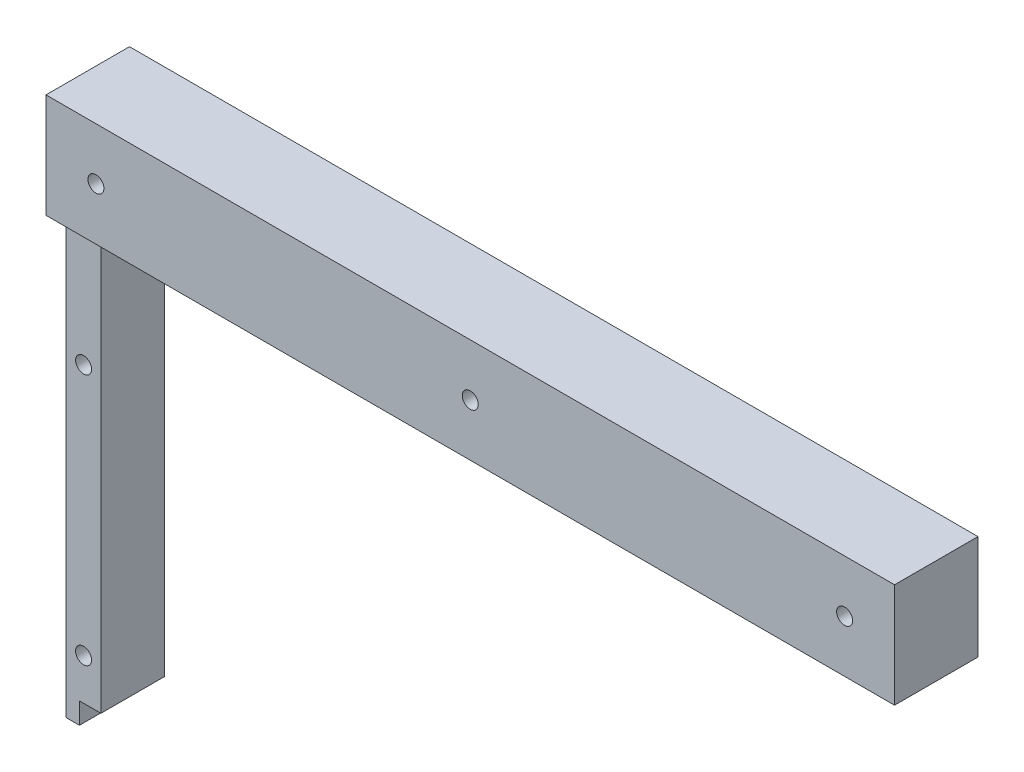
ISO-10303-21;
HEADER;
FILE_DESCRIPTION(('STEP AP214'),'2;1');
FILE_NAME('part.step','',(''),(''),'','','');
FILE_SCHEMA(('AUTOMOTIVE_DESIGN { 1 0 10303 214 1 1 1 1 }'));
ENDSEC;
DATA;
#1=APPLICATION_CONTEXT('core data for automotive mechanical design processes');
#2=APPLICATION_PROTOCOL_DEFINITION('international standard','automotive_design',2000,#1);
#3=PRODUCT_CONTEXT('',#1,'mechanical');
#4=PRODUCT('Part','Part','',(#3));
#5=PRODUCT_RELATED_PRODUCT_CATEGORY('part','',(#4));
#6=PRODUCT_DEFINITION_FORMATION('','',#4);
#7=PRODUCT_DEFINITION_CONTEXT('part definition',#1,'design');
#8=PRODUCT_DEFINITION('design','',#6,#7);
#9=PRODUCT_DEFINITION_SHAPE('','',#8);
#10=(LENGTH_UNIT() NAMED_UNIT(*) SI_UNIT(.MILLI.,.METRE.));
#11=(NAMED_UNIT(*) PLANE_ANGLE_UNIT() SI_UNIT($,.RADIAN.));
#12=(NAMED_UNIT(*) SI_UNIT($,.STERADIAN.) SOLID_ANGLE_UNIT());
#13=UNCERTAINTY_MEASURE_WITH_UNIT(LENGTH_MEASURE(1.E-05),#10,'distance_accuracy_value','');
#14=(GEOMETRIC_REPRESENTATION_CONTEXT(3) GLOBAL_UNCERTAINTY_ASSIGNED_CONTEXT((#13)) GLOBAL_UNIT_ASSIGNED_CONTEXT((#10,
#11,#12)) REPRESENTATION_CONTEXT('',''));
#15=CARTESIAN_POINT('',(0.,0.,0.));
#16=DIRECTION('',(0.,0.,1.));
#17=DIRECTION('',(1.,0.,0.));
#18=AXIS2_PLACEMENT_3D('',#15,#16,#17);
#19=CARTESIAN_POINT('',(-42.3157395725298,7.80592584925444,10.));
#20=DIRECTION('',(0.,1.,0.));
#21=DIRECTION('',(0.,0.,1.));
#22=AXIS2_PLACEMENT_3D('',#19,#20,#21);
#23=PLANE('',#22);
#24=DIRECTION('',(0.,0.,1.));
#25=VECTOR('',#24,1.);
#26=CARTESIAN_POINT('',(-110.544808884963,7.80592584925444,12.));
#27=LINE('',#26,#25);
#28=CARTESIAN_POINT('',(-110.544808884963,7.80592584925444,0.));
#29=VERTEX_POINT('',#28);
#30=CARTESIAN_POINT('',(-110.544808884963,7.80592584925444,9.0999999998743));
#31=VERTEX_POINT('',#30);
#32=EDGE_CURVE('E200',#29,#31,#27,.T.);
#33=ORIENTED_EDGE('',*,*,#32,.F.);
#34=DIRECTION('',(1.,0.,0.));
#35=VECTOR('',#34,1.);
#36=CARTESIAN_POINT('',(-42.3157395725298,7.80592584925444,0.));
#37=LINE('',#36,#35);
#38=CARTESIAN_POINT('',(6.45061647060174,7.80592584925444,0.));
#39=VERTEX_POINT('',#38);
#40=EDGE_CURVE('E53',#29,#39,#37,.T.);
#41=ORIENTED_EDGE('',*,*,#40,.T.);
#42=DIRECTION('',(0.,0.,-1.));
#43=VECTOR('',#42,1.);
#44=CARTESIAN_POINT('',(6.45061647060174,7.80592584925444,10.));
#45=LINE('',#44,#43);
#46=CARTESIAN_POINT('',(6.45061647060174,7.80592584925444,12.));
#47=VERTEX_POINT('',#46);
#48=EDGE_CURVE('E11',#47,#39,#45,.T.);
#49=ORIENTED_EDGE('',*,*,#48,.F.);
#50=DIRECTION('',(1.,0.,0.));
#51=VECTOR('',#50,1.);
#52=CARTESIAN_POINT('',(6.45061647060174,7.80592584925444,12.));
#53=LINE('',#52,#51);
#54=CARTESIAN_POINT('',(-115.549383529398,7.8059258492509,12.));
#55=VERTEX_POINT('',#54);
#56=EDGE_CURVE('E150',#55,#47,#53,.T.);
#57=ORIENTED_EDGE('',*,*,#56,.F.);
#58=DIRECTION('',(0.,0.,-1.));
#59=VECTOR('',#58,1.);
#60=CARTESIAN_POINT('',(-115.549383529398,7.8059258492509,9.0999999998743));
#61=LINE('',#60,#59);
#62=CARTESIAN_POINT('',(-115.549383529398,7.8059258492509,9.0999999998743));
#63=VERTEX_POINT('',#62);
#64=EDGE_CURVE('E110',#55,#63,#61,.T.);
#65=ORIENTED_EDGE('',*,*,#64,.T.);
#66=DIRECTION('',(-1.,0.,0.));
#67=VECTOR('',#66,1.);
#68=CARTESIAN_POINT('',(-46.4791394511663,7.80592584925083,9.09999999987429));
#69=LINE('',#68,#67);
#70=EDGE_CURVE('E47',#31,#63,#69,.T.);
#71=ORIENTED_EDGE('',*,*,#70,.F.);
#72=EDGE_LOOP('',(#33,#41,#49,#57,#65,#71));
#73=FACE_BOUND('',#72,.T.);
#74=ADVANCED_FACE('F32',(#73),#23,.F.);
#75=CARTESIAN_POINT('',(0.,-56.1940741507476,0.));
#76=DIRECTION('',(0.,1.,0.));
#77=DIRECTION('',(0.,0.,1.));
#78=AXIS2_PLACEMENT_3D('',#75,#76,#77);
#79=PLANE('',#78);
#80=DIRECTION('',(0.,0.,-1.));
#81=VECTOR('',#80,1.);
#82=CARTESIAN_POINT('',(-113.644808884963,-56.1940741507476,0.));
#83=LINE('',#82,#81);
#84=CARTESIAN_POINT('',(-113.644808884963,-56.1940741507476,9.0999999998743));
#85=VERTEX_POINT('',#84);
#86=CARTESIAN_POINT('',(-113.644808884963,-56.1940741507476,0.));
#87=VERTEX_POINT('',#86);
#88=EDGE_CURVE('E118',#85,#87,#83,.T.);
#89=ORIENTED_EDGE('',*,*,#88,.F.);
#90=DIRECTION('',(-1.,0.,0.));
#91=VECTOR('',#90,1.);
#92=CARTESIAN_POINT('',(-46.4791394511664,-56.1940741507477,9.09999999987429));
#93=LINE('',#92,#91);
#94=CARTESIAN_POINT('',(-115.549383529398,-56.1940741507476,9.0999999998743));
#95=VERTEX_POINT('',#94);
#96=EDGE_CURVE('E105',#85,#95,#93,.T.);
#97=ORIENTED_EDGE('',*,*,#96,.T.);
#98=DIRECTION('',(0.,0.,-1.));
#99=VECTOR('',#98,1.);
#100=CARTESIAN_POINT('',(-115.549383529398,-56.1940741507476,0.));
#101=LINE('',#100,#99);
#102=CARTESIAN_POINT('',(-115.549383529398,-56.1940741507476,0.));
#103=VERTEX_POINT('',#102);
#104=EDGE_CURVE('E116',#95,#103,#101,.T.);
#105=ORIENTED_EDGE('',*,*,#104,.T.);
#106=DIRECTION('',(1.,0.,0.));
#107=VECTOR('',#106,1.);
#108=CARTESIAN_POINT('',(-115.549383529398,-56.1940741507476,0.));
#109=LINE('',#108,#107);
#110=EDGE_CURVE('E124',#103,#87,#109,.T.);
#111=ORIENTED_EDGE('',*,*,#110,.T.);
#112=EDGE_LOOP('',(#89,#97,#105,#111));
#113=FACE_BOUND('',#112,.T.);
#114=ADVANCED_FACE('F114',(#113),#79,.F.);
#115=CARTESIAN_POINT('',(6.45061647060174,17.2415064484994,10.));
#116=DIRECTION('',(-1.,0.,0.));
#117=DIRECTION('',(0.,0.,1.));
#118=AXIS2_PLACEMENT_3D('',#115,#116,#117);
#119=PLANE('',#118);
#120=DIRECTION('',(0.,1.,0.));
#121=VECTOR('',#120,1.);
#122=CARTESIAN_POINT('',(6.45061647060174,17.2415064484994,0.));
#123=LINE('',#122,#121);
#124=CARTESIAN_POINT('',(6.45061647060174,22.8059258492525,0.));
#125=VERTEX_POINT('',#124);
#126=EDGE_CURVE('E40',#39,#125,#123,.T.);
#127=ORIENTED_EDGE('',*,*,#126,.T.);
#128=DIRECTION('',(0.,0.,-1.));
#129=VECTOR('',#128,1.);
#130=CARTESIAN_POINT('',(6.45061647060174,22.8059258492525,12.));
#131=LINE('',#130,#129);
#132=CARTESIAN_POINT('',(6.45061647060174,22.8059258492525,12.));
#133=VERTEX_POINT('',#132);
#134=EDGE_CURVE('E138',#133,#125,#131,.T.);
#135=ORIENTED_EDGE('',*,*,#134,.F.);
#136=DIRECTION('',(0.,1.,0.));
#137=VECTOR('',#136,1.);
#138=CARTESIAN_POINT('',(6.45061647060174,17.2415064484994,12.));
#139=LINE('',#138,#137);
#140=EDGE_CURVE('E148',#47,#133,#139,.T.);
#141=ORIENTED_EDGE('',*,*,#140,.F.);
#142=ORIENTED_EDGE('',*,*,#48,.T.);
#143=EDGE_LOOP('',(#127,#135,#141,#142));
#144=FACE_BOUND('',#143,.T.);
#145=ADVANCED_FACE('F156',(#144),#119,.F.);
#146=CARTESIAN_POINT('',(0.,0.,0.));
#147=DIRECTION('',(0.,0.,1.));
#148=DIRECTION('',(1.,0.,0.));
#149=AXIS2_PLACEMENT_3D('',#146,#147,#148);
#150=PLANE('',#149);
#151=CARTESIAN_POINT('',(-113.047096207181,-47.1993941862081,0.));
#152=DIRECTION('',(0.,0.,1.));
#153=DIRECTION('',(1.,0.,0.));
#154=AXIS2_PLACEMENT_3D('',#151,#152,#153);
#155=CIRCLE('',#154,1.15);
#156=CARTESIAN_POINT('',(-111.897096207181,-47.1993941862081,0.));
#157=VERTEX_POINT('',#156);
#158=EDGE_CURVE('E191',#157,#157,#155,.T.);
#159=ORIENTED_EDGE('',*,*,#158,.T.);
#160=EDGE_LOOP('',(#159));
#161=FACE_BOUND('',#160,.T.);
#162=CARTESIAN_POINT('',(-113.047096207181,-10.9967753140126,0.));
#163=DIRECTION('',(0.,0.,1.));
#164=DIRECTION('',(1.,0.,0.));
#165=AXIS2_PLACEMENT_3D('',#162,#163,#164);
#166=CIRCLE('',#165,1.15);
#167=CARTESIAN_POINT('',(-111.897096207181,-10.9967753140126,0.));
#168=VERTEX_POINT('',#167);
#169=EDGE_CURVE('E186',#168,#168,#166,.T.);
#170=ORIENTED_EDGE('',*,*,#169,.T.);
#171=EDGE_LOOP('',(#170));
#172=FACE_BOUND('',#171,.T.);
#173=ORIENTED_EDGE('',*,*,#40,.F.);
#174=DIRECTION('',(0.,1.,0.));
#175=VECTOR('',#174,1.);
#176=CARTESIAN_POINT('',(-110.544808884963,-53.145081868621,0.));
#177=LINE('',#176,#175);
#178=CARTESIAN_POINT('',(-110.544808884963,-53.145081868621,0.));
#179=VERTEX_POINT('',#178);
#180=EDGE_CURVE('E198',#179,#29,#177,.T.);
#181=ORIENTED_EDGE('',*,*,#180,.F.);
#182=DIRECTION('',(1.,0.,0.));
#183=VECTOR('',#182,1.);
#184=CARTESIAN_POINT('',(-113.644808884963,-53.145081868621,0.));
#185=LINE('',#184,#183);
#186=CARTESIAN_POINT('',(-113.644808884963,-53.145081868621,0.));
#187=VERTEX_POINT('',#186);
#188=EDGE_CURVE('E125',#187,#179,#185,.T.);
#189=ORIENTED_EDGE('',*,*,#188,.F.);
#190=DIRECTION('',(0.,1.,0.));
#191=VECTOR('',#190,1.);
#192=CARTESIAN_POINT('',(-113.644808884963,-56.1940741507476,0.));
#193=LINE('',#192,#191);
#194=EDGE_CURVE('E168',#87,#187,#193,.T.);
#195=ORIENTED_EDGE('',*,*,#194,.F.);
#196=ORIENTED_EDGE('',*,*,#110,.F.);
#197=DIRECTION('',(0.,1.,0.));
#198=VECTOR('',#197,1.);
#199=CARTESIAN_POINT('',(-115.549383529398,17.2415064484994,0.));
#200=LINE('',#199,#198);
#201=CARTESIAN_POINT('',(-115.549383529398,22.8059258492525,0.));
#202=VERTEX_POINT('',#201);
#203=EDGE_CURVE('E122',#103,#202,#200,.T.);
#204=ORIENTED_EDGE('',*,*,#203,.T.);
#205=DIRECTION('',(-1.,0.,0.));
#206=VECTOR('',#205,1.);
#207=CARTESIAN_POINT('',(-115.549383529398,22.8059258492525,0.));
#208=LINE('',#207,#206);
#209=EDGE_CURVE('E141',#125,#202,#208,.T.);
#210=ORIENTED_EDGE('',*,*,#209,.F.);
#211=ORIENTED_EDGE('',*,*,#126,.F.);
#212=EDGE_LOOP('',(#173,#181,#189,#195,#196,#204,#210,#211));
#213=FACE_BOUND('',#212,.T.);
#214=CARTESIAN_POINT('',(-0.724809871131812,15.3059258492535,0.));
#215=DIRECTION('',(0.,0.,1.));
#216=DIRECTION('',(-1.,0.,0.));
#217=AXIS2_PLACEMENT_3D('',#214,#215,#216);
#218=CIRCLE('',#217,1.15);
#219=CARTESIAN_POINT('',(-1.87480987113182,15.3059258492535,0.));
#220=VERTEX_POINT('',#219);
#221=EDGE_CURVE('E210',#220,#220,#218,.T.);
#222=ORIENTED_EDGE('',*,*,#221,.T.);
#223=EDGE_LOOP('',(#222));
#224=FACE_BOUND('',#223,.T.);
#225=CARTESIAN_POINT('',(-108.373957187665,15.3059258492535,0.));
#226=DIRECTION('',(0.,0.,1.));
#227=DIRECTION('',(1.,0.,0.));
#228=AXIS2_PLACEMENT_3D('',#225,#226,#227);
#229=CIRCLE('',#228,1.15);
#230=CARTESIAN_POINT('',(-107.223957187665,15.3059258492535,0.));
#231=VERTEX_POINT('',#230);
#232=EDGE_CURVE('E204',#231,#231,#229,.T.);
#233=ORIENTED_EDGE('',*,*,#232,.T.);
#234=EDGE_LOOP('',(#233));
#235=FACE_BOUND('',#234,.T.);
#236=CARTESIAN_POINT('',(-54.5493835293982,15.3059258492535,0.));
#237=DIRECTION('',(0.,0.,1.));
#238=DIRECTION('',(1.,0.,0.));
#239=AXIS2_PLACEMENT_3D('',#236,#237,#238);
#240=CIRCLE('',#239,1.15);
#241=CARTESIAN_POINT('',(-53.3993835293982,15.3059258492535,0.));
#242=VERTEX_POINT('',#241);
#243=EDGE_CURVE('E173',#242,#242,#240,.T.);
#244=ORIENTED_EDGE('',*,*,#243,.T.);
#245=EDGE_LOOP('',(#244));
#246=FACE_BOUND('',#245,.T.);
#247=ADVANCED_FACE('F163',(#161,#172,#213,#224,#235,#246),#150,.F.);
#248=CARTESIAN_POINT('',(0.,0.,12.));
#249=DIRECTION('',(0.,0.,-1.));
#250=DIRECTION('',(-1.,0.,0.));
#251=AXIS2_PLACEMENT_3D('',#248,#249,#250);
#252=PLANE('',#251);
#253=DIRECTION('',(0.,-1.,0.));
#254=VECTOR('',#253,1.);
#255=CARTESIAN_POINT('',(-115.549383529398,17.2415064484994,12.));
#256=LINE('',#255,#254);
#257=CARTESIAN_POINT('',(-115.549383529398,22.8059258492525,12.));
#258=VERTEX_POINT('',#257);
#259=EDGE_CURVE('E145',#258,#55,#256,.T.);
#260=ORIENTED_EDGE('',*,*,#259,.T.);
#261=ORIENTED_EDGE('',*,*,#56,.T.);
#262=ORIENTED_EDGE('',*,*,#140,.T.);
#263=DIRECTION('',(1.,0.,0.));
#264=VECTOR('',#263,1.);
#265=CARTESIAN_POINT('',(-115.549383529398,22.8059258492525,12.));
#266=LINE('',#265,#264);
#267=EDGE_CURVE('E135',#258,#133,#266,.T.);
#268=ORIENTED_EDGE('',*,*,#267,.F.);
#269=EDGE_LOOP('',(#260,#261,#262,#268));
#270=FACE_BOUND('',#269,.T.);
#271=CARTESIAN_POINT('',(-0.724809871131812,15.3059258492535,12.));
#272=DIRECTION('',(0.,0.,1.));
#273=DIRECTION('',(-1.,0.,0.));
#274=AXIS2_PLACEMENT_3D('',#271,#272,#273);
#275=CIRCLE('',#274,1.15);
#276=CARTESIAN_POINT('',(-1.87480987113182,15.3059258492535,12.));
#277=VERTEX_POINT('',#276);
#278=EDGE_CURVE('E203',#277,#277,#275,.T.);
#279=ORIENTED_EDGE('',*,*,#278,.F.);
#280=EDGE_LOOP('',(#279));
#281=FACE_BOUND('',#280,.T.);
#282=CARTESIAN_POINT('',(-108.373957187665,15.3059258492535,12.));
#283=DIRECTION('',(0.,0.,1.));
#284=DIRECTION('',(1.,0.,0.));
#285=AXIS2_PLACEMENT_3D('',#282,#283,#284);
#286=CIRCLE('',#285,1.15);
#287=CARTESIAN_POINT('',(-107.223957187665,15.3059258492535,12.));
#288=VERTEX_POINT('',#287);
#289=EDGE_CURVE('E207',#288,#288,#286,.T.);
#290=ORIENTED_EDGE('',*,*,#289,.F.);
#291=EDGE_LOOP('',(#290));
#292=FACE_BOUND('',#291,.T.);
#293=CARTESIAN_POINT('',(-54.5493835293982,15.3059258492535,12.));
#294=DIRECTION('',(0.,0.,1.));
#295=DIRECTION('',(1.,0.,0.));
#296=AXIS2_PLACEMENT_3D('',#293,#294,#295);
#297=CIRCLE('',#296,1.15);
#298=CARTESIAN_POINT('',(-53.3993835293982,15.3059258492535,12.));
#299=VERTEX_POINT('',#298);
#300=EDGE_CURVE('E177',#299,#299,#297,.T.);
#301=ORIENTED_EDGE('',*,*,#300,.F.);
#302=EDGE_LOOP('',(#301));
#303=FACE_BOUND('',#302,.T.);
#304=ADVANCED_FACE('F218',(#270,#281,#292,#303),#252,.F.);
#305=CARTESIAN_POINT('',(-115.549383529398,-56.1940741507483,239.999999999997));
#306=DIRECTION('',(1.,0.,0.));
#307=DIRECTION('',(0.,0.,-1.));
#308=AXIS2_PLACEMENT_3D('',#305,#306,#307);
#309=PLANE('',#308);
#310=ORIENTED_EDGE('',*,*,#104,.F.);
#311=DIRECTION('',(0.,-1.,0.));
#312=VECTOR('',#311,1.);
#313=CARTESIAN_POINT('',(-115.549383529398,7.8059258492509,9.0999999998743));
#314=LINE('',#313,#312);
#315=EDGE_CURVE('E102',#63,#95,#314,.T.);
#316=ORIENTED_EDGE('',*,*,#315,.F.);
#317=ORIENTED_EDGE('',*,*,#64,.F.);
#318=ORIENTED_EDGE('',*,*,#259,.F.);
#319=DIRECTION('',(0.,0.,1.));
#320=VECTOR('',#319,1.);
#321=CARTESIAN_POINT('',(-115.549383529398,22.8059258492525,12.));
#322=LINE('',#321,#320);
#323=EDGE_CURVE('E127',#202,#258,#322,.T.);
#324=ORIENTED_EDGE('',*,*,#323,.F.);
#325=ORIENTED_EDGE('',*,*,#203,.F.);
#326=EDGE_LOOP('',(#310,#316,#317,#318,#324,#325));
#327=FACE_BOUND('',#326,.T.);
#328=ADVANCED_FACE('F120',(#327),#309,.F.);
#329=CARTESIAN_POINT('',(0.,22.8059258492525,0.));
#330=DIRECTION('',(0.,-1.,0.));
#331=DIRECTION('',(0.,0.,-1.));
#332=AXIS2_PLACEMENT_3D('',#329,#330,#331);
#333=PLANE('',#332);
#334=ORIENTED_EDGE('',*,*,#323,.T.);
#335=ORIENTED_EDGE('',*,*,#267,.T.);
#336=ORIENTED_EDGE('',*,*,#134,.T.);
#337=ORIENTED_EDGE('',*,*,#209,.T.);
#338=EDGE_LOOP('',(#334,#335,#336,#337));
#339=FACE_BOUND('',#338,.T.);
#340=ADVANCED_FACE('F161',(#339),#333,.F.);
#341=CARTESIAN_POINT('',(-113.644808884963,-53.145081868621,0.));
#342=DIRECTION('',(0.,1.,0.));
#343=DIRECTION('',(0.,0.,1.));
#344=AXIS2_PLACEMENT_3D('',#341,#342,#343);
#345=PLANE('',#344);
#346=DIRECTION('',(0.,0.,-1.));
#347=VECTOR('',#346,1.);
#348=CARTESIAN_POINT('',(-110.544808884963,-53.145081868621,12.));
#349=LINE('',#348,#347);
#350=CARTESIAN_POINT('',(-110.544808884963,-53.145081868621,9.0999999998743));
#351=VERTEX_POINT('',#350);
#352=EDGE_CURVE('E194',#351,#179,#349,.T.);
#353=ORIENTED_EDGE('',*,*,#352,.F.);
#354=DIRECTION('',(-1.,0.,0.));
#355=VECTOR('',#354,1.);
#356=CARTESIAN_POINT('',(-113.644808884963,-53.145081868621,9.0999999998743));
#357=LINE('',#356,#355);
#358=CARTESIAN_POINT('',(-113.644808884963,-53.145081868621,9.0999999998743));
#359=VERTEX_POINT('',#358);
#360=EDGE_CURVE('E183',#351,#359,#357,.T.);
#361=ORIENTED_EDGE('',*,*,#360,.T.);
#362=DIRECTION('',(0.,0.,1.));
#363=VECTOR('',#362,1.);
#364=CARTESIAN_POINT('',(-113.644808884963,-53.145081868621,0.));
#365=LINE('',#364,#363);
#366=EDGE_CURVE('E172',#187,#359,#365,.T.);
#367=ORIENTED_EDGE('',*,*,#366,.F.);
#368=ORIENTED_EDGE('',*,*,#188,.T.);
#369=EDGE_LOOP('',(#353,#361,#367,#368));
#370=FACE_BOUND('',#369,.T.);
#371=ADVANCED_FACE('F239',(#370),#345,.F.);
#372=CARTESIAN_POINT('',(-113.644808884963,0.,0.));
#373=DIRECTION('',(1.,0.,0.));
#374=DIRECTION('',(0.,0.,-1.));
#375=AXIS2_PLACEMENT_3D('',#372,#373,#374);
#376=PLANE('',#375);
#377=DIRECTION('',(0.,1.,0.));
#378=VECTOR('',#377,1.);
#379=CARTESIAN_POINT('',(-113.644808884963,0.,9.0999999998743));
#380=LINE('',#379,#378);
#381=EDGE_CURVE('E181',#85,#359,#380,.T.);
#382=ORIENTED_EDGE('',*,*,#381,.F.);
#383=ORIENTED_EDGE('',*,*,#88,.T.);
#384=ORIENTED_EDGE('',*,*,#194,.T.);
#385=ORIENTED_EDGE('',*,*,#366,.T.);
#386=EDGE_LOOP('',(#382,#383,#384,#385));
#387=FACE_BOUND('',#386,.T.);
#388=ADVANCED_FACE('F180',(#387),#376,.T.);
#389=CARTESIAN_POINT('',(-54.5493835293982,15.3059258492535,0.));
#390=DIRECTION('',(0.,0.,1.));
#391=DIRECTION('',(1.,0.,0.));
#392=AXIS2_PLACEMENT_3D('',#389,#390,#391);
#393=CYLINDRICAL_SURFACE('',#392,1.15);
#394=ORIENTED_EDGE('',*,*,#243,.F.);
#395=EDGE_LOOP('',(#394));
#396=FACE_BOUND('',#395,.T.);
#397=ORIENTED_EDGE('',*,*,#300,.T.);
#398=EDGE_LOOP('',(#397));
#399=FACE_BOUND('',#398,.T.);
#400=ADVANCED_FACE('F228',(#396,#399),#393,.F.);
#401=CARTESIAN_POINT('',(-108.373957187665,15.3059258492535,0.));
#402=DIRECTION('',(0.,0.,1.));
#403=DIRECTION('',(1.,0.,0.));
#404=AXIS2_PLACEMENT_3D('',#401,#402,#403);
#405=CYLINDRICAL_SURFACE('',#404,1.15);
#406=ORIENTED_EDGE('',*,*,#232,.F.);
#407=EDGE_LOOP('',(#406));
#408=FACE_BOUND('',#407,.T.);
#409=ORIENTED_EDGE('',*,*,#289,.T.);
#410=EDGE_LOOP('',(#409));
#411=FACE_BOUND('',#410,.T.);
#412=ADVANCED_FACE('F230',(#408,#411),#405,.F.);
#413=CARTESIAN_POINT('',(-0.724809871131812,15.3059258492535,0.));
#414=DIRECTION('',(0.,0.,1.));
#415=DIRECTION('',(1.,0.,0.));
#416=AXIS2_PLACEMENT_3D('',#413,#414,#415);
#417=CYLINDRICAL_SURFACE('',#416,1.15);
#418=ORIENTED_EDGE('',*,*,#221,.F.);
#419=EDGE_LOOP('',(#418));
#420=FACE_BOUND('',#419,.T.);
#421=ORIENTED_EDGE('',*,*,#278,.T.);
#422=EDGE_LOOP('',(#421));
#423=FACE_BOUND('',#422,.T.);
#424=ADVANCED_FACE('F216',(#420,#423),#417,.F.);
#425=CARTESIAN_POINT('',(-110.544808884963,0.,0.));
#426=DIRECTION('',(-1.,0.,0.));
#427=DIRECTION('',(0.,0.,1.));
#428=AXIS2_PLACEMENT_3D('',#425,#426,#427);
#429=PLANE('',#428);
#430=ORIENTED_EDGE('',*,*,#32,.T.);
#431=DIRECTION('',(0.,1.,0.));
#432=VECTOR('',#431,1.);
#433=CARTESIAN_POINT('',(-110.544808884963,7.80592584925083,9.0999999998743));
#434=LINE('',#433,#432);
#435=EDGE_CURVE('E252',#351,#31,#434,.T.);
#436=ORIENTED_EDGE('',*,*,#435,.F.);
#437=ORIENTED_EDGE('',*,*,#352,.T.);
#438=ORIENTED_EDGE('',*,*,#180,.T.);
#439=EDGE_LOOP('',(#430,#436,#437,#438));
#440=FACE_BOUND('',#439,.T.);
#441=ADVANCED_FACE('F250',(#440),#429,.F.);
#442=CARTESIAN_POINT('',(-113.047096207181,-10.9967753140126,0.));
#443=DIRECTION('',(0.,0.,1.));
#444=DIRECTION('',(1.,0.,0.));
#445=AXIS2_PLACEMENT_3D('',#442,#443,#444);
#446=CYLINDRICAL_SURFACE('',#445,1.15);
#447=CARTESIAN_POINT('',(-113.047096207181,-10.9967753140126,9.0999999998743));
#448=DIRECTION('',(0.,0.,-1.));
#449=DIRECTION('',(-1.,0.,0.));
#450=AXIS2_PLACEMENT_3D('',#447,#448,#449);
#451=CIRCLE('',#450,1.15);
#452=CARTESIAN_POINT('',(-114.197096207181,-10.9967753140126,9.0999999998743));
#453=VERTEX_POINT('',#452);
#454=EDGE_CURVE('E184',#453,#453,#451,.F.);
#455=ORIENTED_EDGE('',*,*,#454,.T.);
#456=EDGE_LOOP('',(#455));
#457=FACE_BOUND('',#456,.T.);
#458=ORIENTED_EDGE('',*,*,#169,.F.);
#459=EDGE_LOOP('',(#458));
#460=FACE_BOUND('',#459,.T.);
#461=ADVANCED_FACE('F268',(#457,#460),#446,.F.);
#462=CARTESIAN_POINT('',(-113.047096207181,-47.1993941862081,0.));
#463=DIRECTION('',(0.,0.,1.));
#464=DIRECTION('',(1.,0.,0.));
#465=AXIS2_PLACEMENT_3D('',#462,#463,#464);
#466=CYLINDRICAL_SURFACE('',#465,1.15);
#467=CARTESIAN_POINT('',(-113.047096207181,-47.1993941862081,9.0999999998743));
#468=DIRECTION('',(0.,0.,-1.));
#469=DIRECTION('',(-1.,0.,0.));
#470=AXIS2_PLACEMENT_3D('',#467,#468,#469);
#471=CIRCLE('',#470,1.15);
#472=CARTESIAN_POINT('',(-114.197096207181,-47.1993941862081,9.0999999998743));
#473=VERTEX_POINT('',#472);
#474=EDGE_CURVE('E35',#473,#473,#471,.F.);
#475=ORIENTED_EDGE('',*,*,#474,.T.);
#476=EDGE_LOOP('',(#475));
#477=FACE_BOUND('',#476,.T.);
#478=ORIENTED_EDGE('',*,*,#158,.F.);
#479=EDGE_LOOP('',(#478));
#480=FACE_BOUND('',#479,.T.);
#481=ADVANCED_FACE('F260',(#477,#480),#466,.F.);
#482=CARTESIAN_POINT('',(-46.4791394511663,7.80592584925083,9.09999999987429));
#483=DIRECTION('',(0.,0.,-1.));
#484=DIRECTION('',(-1.,0.,0.));
#485=AXIS2_PLACEMENT_3D('',#482,#483,#484);
#486=PLANE('',#485);
#487=ORIENTED_EDGE('',*,*,#474,.F.);
#488=EDGE_LOOP('',(#487));
#489=FACE_BOUND('',#488,.T.);
#490=ORIENTED_EDGE('',*,*,#454,.F.);
#491=EDGE_LOOP('',(#490));
#492=FACE_BOUND('',#491,.T.);
#493=ORIENTED_EDGE('',*,*,#435,.T.);
#494=ORIENTED_EDGE('',*,*,#70,.T.);
#495=ORIENTED_EDGE('',*,*,#315,.T.);
#496=ORIENTED_EDGE('',*,*,#96,.F.);
#497=ORIENTED_EDGE('',*,*,#381,.T.);
#498=ORIENTED_EDGE('',*,*,#360,.F.);
#499=EDGE_LOOP('',(#493,#494,#495,#496,#497,#498));
#500=FACE_BOUND('',#499,.T.);
#501=ADVANCED_FACE('F104',(#489,#492,#500),#486,.F.);
#502=CLOSED_SHELL('',(#74,#114,#145,#247,#304,#328,#340,#371,#388,#400,#412,#424,#441,#461,#481,#501));
#503=MANIFOLD_SOLID_BREP('B2',#502);
#504=ADVANCED_BREP_SHAPE_REPRESENTATION('',(#18,#503),#14);
#505=SHAPE_DEFINITION_REPRESENTATION(#9,#504);
ENDSEC;
END-ISO-10303-21;
